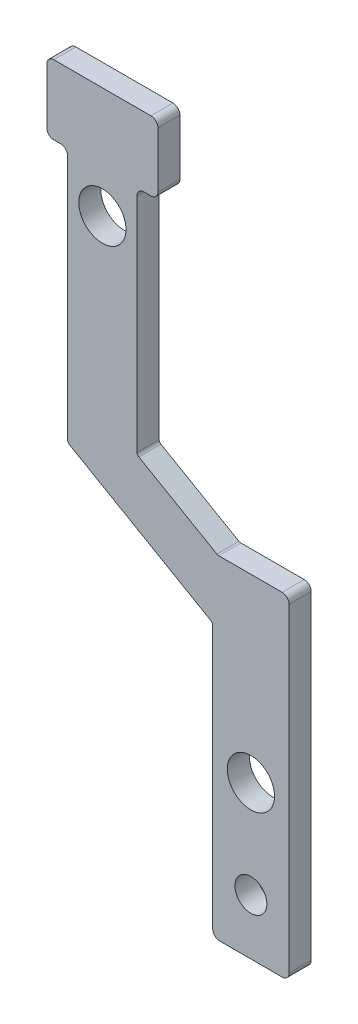
ISO-10303-21;
HEADER;
FILE_DESCRIPTION(('STEP AP214'),'2;1');
FILE_NAME('part.step','',(''),(''),'','','');
FILE_SCHEMA(('AUTOMOTIVE_DESIGN { 1 0 10303 214 1 1 1 1 }'));
ENDSEC;
DATA;
#1=APPLICATION_CONTEXT('core data for automotive mechanical design processes');
#2=APPLICATION_PROTOCOL_DEFINITION('international standard','automotive_design',2000,#1);
#3=PRODUCT_CONTEXT('',#1,'mechanical');
#4=PRODUCT('Part','Part','',(#3));
#5=PRODUCT_RELATED_PRODUCT_CATEGORY('part','',(#4));
#6=PRODUCT_DEFINITION_FORMATION('','',#4);
#7=PRODUCT_DEFINITION_CONTEXT('part definition',#1,'design');
#8=PRODUCT_DEFINITION('design','',#6,#7);
#9=PRODUCT_DEFINITION_SHAPE('','',#8);
#10=(LENGTH_UNIT() NAMED_UNIT(*) SI_UNIT(.MILLI.,.METRE.));
#11=(NAMED_UNIT(*) PLANE_ANGLE_UNIT() SI_UNIT($,.RADIAN.));
#12=(NAMED_UNIT(*) SI_UNIT($,.STERADIAN.) SOLID_ANGLE_UNIT());
#13=UNCERTAINTY_MEASURE_WITH_UNIT(LENGTH_MEASURE(1.E-05),#10,'distance_accuracy_value','');
#14=(GEOMETRIC_REPRESENTATION_CONTEXT(3) GLOBAL_UNCERTAINTY_ASSIGNED_CONTEXT((#13)) GLOBAL_UNIT_ASSIGNED_CONTEXT((#10,
#11,#12)) REPRESENTATION_CONTEXT('',''));
#15=CARTESIAN_POINT('',(0.,0.,0.));
#16=DIRECTION('',(0.,0.,1.));
#17=DIRECTION('',(1.,0.,0.));
#18=AXIS2_PLACEMENT_3D('',#15,#16,#17);
#19=CARTESIAN_POINT('',(8.00627,44.50635,1.59144));
#20=DIRECTION('',(0.,0.,-1.));
#21=DIRECTION('',(-1.,0.,0.));
#22=AXIS2_PLACEMENT_3D('',#19,#20,#21);
#23=PLANE('',#22);
#24=CARTESIAN_POINT('',(15.206,4.006,1.59144));
#25=DIRECTION('',(0.,0.,1.));
#26=DIRECTION('',(1.,0.,0.));
#27=AXIS2_PLACEMENT_3D('',#24,#25,#26);
#28=CIRCLE('',#27,1.15);
#29=CARTESIAN_POINT('',(16.356,4.006,1.59144));
#30=VERTEX_POINT('',#29);
#31=EDGE_CURVE('E469',#30,#30,#28,.T.);
#32=ORIENTED_EDGE('',*,*,#31,.F.);
#33=EDGE_LOOP('',(#32));
#34=FACE_BOUND('',#33,.T.);
#35=CARTESIAN_POINT('',(4.50627,41.00635,1.59144));
#36=DIRECTION('',(0.,0.,1.));
#37=DIRECTION('',(1.,0.,0.));
#38=AXIS2_PLACEMENT_3D('',#35,#36,#37);
#39=CIRCLE('',#38,1.7);
#40=CARTESIAN_POINT('',(6.20627,41.00635,1.59144));
#41=VERTEX_POINT('',#40);
#42=EDGE_CURVE('E471',#41,#41,#39,.T.);
#43=ORIENTED_EDGE('',*,*,#42,.F.);
#44=EDGE_LOOP('',(#43));
#45=FACE_BOUND('',#44,.T.);
#46=CARTESIAN_POINT('',(8.00627,44.50635,1.59144));
#47=DIRECTION('',(0.,0.,1.));
#48=DIRECTION('',(-1.,0.,0.));
#49=AXIS2_PLACEMENT_3D('',#46,#47,#48);
#50=CIRCLE('',#49,0.5);
#51=CARTESIAN_POINT('',(8.00627,44.00635,1.59144));
#52=VERTEX_POINT('',#51);
#53=CARTESIAN_POINT('',(8.50627,44.50635,1.59144));
#54=VERTEX_POINT('',#53);
#55=EDGE_CURVE('E295',#52,#54,#50,.T.);
#56=ORIENTED_EDGE('',*,*,#55,.T.);
#57=DIRECTION('',(0.,1.,0.));
#58=VECTOR('',#57,1.);
#59=CARTESIAN_POINT('',(8.50627,48.50635,1.59144));
#60=LINE('',#59,#58);
#61=CARTESIAN_POINT('',(8.50627,48.50635,1.59144));
#62=VERTEX_POINT('',#61);
#63=EDGE_CURVE('E153',#54,#62,#60,.T.);
#64=ORIENTED_EDGE('',*,*,#63,.T.);
#65=CARTESIAN_POINT('',(8.00627,48.50635,1.59144));
#66=DIRECTION('',(0.,0.,1.));
#67=DIRECTION('',(-1.,0.,0.));
#68=AXIS2_PLACEMENT_3D('',#65,#66,#67);
#69=CIRCLE('',#68,0.500000000000002);
#70=CARTESIAN_POINT('',(8.00627,49.00635,1.59144));
#71=VERTEX_POINT('',#70);
#72=EDGE_CURVE('E364',#62,#71,#69,.T.);
#73=ORIENTED_EDGE('',*,*,#72,.T.);
#74=DIRECTION('',(-1.,0.,0.));
#75=VECTOR('',#74,1.);
#76=CARTESIAN_POINT('',(1.00627,49.00635,1.59144));
#77=LINE('',#76,#75);
#78=CARTESIAN_POINT('',(1.00627,49.00635,1.59144));
#79=VERTEX_POINT('',#78);
#80=EDGE_CURVE('E383',#71,#79,#77,.T.);
#81=ORIENTED_EDGE('',*,*,#80,.T.);
#82=CARTESIAN_POINT('',(1.00627,48.50635,1.59144));
#83=DIRECTION('',(0.,0.,1.));
#84=DIRECTION('',(-1.,0.,0.));
#85=AXIS2_PLACEMENT_3D('',#82,#83,#84);
#86=CIRCLE('',#85,0.499999999999999);
#87=CARTESIAN_POINT('',(0.506269999999998,48.50635,1.59144));
#88=VERTEX_POINT('',#87);
#89=EDGE_CURVE('E380',#79,#88,#86,.T.);
#90=ORIENTED_EDGE('',*,*,#89,.T.);
#91=DIRECTION('',(0.,-1.,0.));
#92=VECTOR('',#91,1.);
#93=CARTESIAN_POINT('',(0.506269999999999,44.50635,1.59144));
#94=LINE('',#93,#92);
#95=CARTESIAN_POINT('',(0.506269999999999,44.50635,1.59144));
#96=VERTEX_POINT('',#95);
#97=EDGE_CURVE('E382',#88,#96,#94,.T.);
#98=ORIENTED_EDGE('',*,*,#97,.T.);
#99=CARTESIAN_POINT('',(1.00627,44.50635,1.59144));
#100=DIRECTION('',(0.,0.,1.));
#101=DIRECTION('',(-1.,0.,0.));
#102=AXIS2_PLACEMENT_3D('',#99,#100,#101);
#103=CIRCLE('',#102,0.500000000000001);
#104=CARTESIAN_POINT('',(1.00627,44.00635,1.59144));
#105=VERTEX_POINT('',#104);
#106=EDGE_CURVE('E385',#96,#105,#103,.T.);
#107=ORIENTED_EDGE('',*,*,#106,.T.);
#108=DIRECTION('',(1.,0.,0.));
#109=VECTOR('',#108,1.);
#110=CARTESIAN_POINT('',(1.50627,44.00635,1.59144));
#111=LINE('',#110,#109);
#112=CARTESIAN_POINT('',(1.50627,44.00635,1.59144));
#113=VERTEX_POINT('',#112);
#114=EDGE_CURVE('E391',#105,#113,#111,.T.);
#115=ORIENTED_EDGE('',*,*,#114,.T.);
#116=CARTESIAN_POINT('',(1.50627,43.50635,1.59144));
#117=DIRECTION('',(0.,0.,-1.));
#118=DIRECTION('',(1.,0.,0.));
#119=AXIS2_PLACEMENT_3D('',#116,#117,#118);
#120=CIRCLE('',#119,0.499999999999999);
#121=CARTESIAN_POINT('',(2.00627,43.50635,1.59144));
#122=VERTEX_POINT('',#121);
#123=EDGE_CURVE('E393',#113,#122,#120,.T.);
#124=ORIENTED_EDGE('',*,*,#123,.T.);
#125=DIRECTION('',(0.,-1.,0.));
#126=VECTOR('',#125,1.);
#127=CARTESIAN_POINT('',(2.00627,25.7742991924311,1.59144));
#128=LINE('',#127,#126);
#129=CARTESIAN_POINT('',(2.00627,25.7742991924311,1.59144));
#130=VERTEX_POINT('',#129);
#131=EDGE_CURVE('E395',#122,#130,#128,.T.);
#132=ORIENTED_EDGE('',*,*,#131,.T.);
#133=CARTESIAN_POINT('',(2.25627000000001,25.7742991924311,1.59144));
#134=DIRECTION('',(0.,0.,1.));
#135=DIRECTION('',(-1.,0.,0.));
#136=AXIS2_PLACEMENT_3D('',#133,#134,#135);
#137=CIRCLE('',#136,0.250000000000003);
#138=CARTESIAN_POINT('',(2.13127000000001,25.557792841485,1.59144));
#139=VERTEX_POINT('',#138);
#140=EDGE_CURVE('E397',#130,#139,#137,.T.);
#141=ORIENTED_EDGE('',*,*,#140,.T.);
#142=DIRECTION('',(0.866025403784439,-0.5,0.));
#143=VECTOR('',#142,1.);
#144=CARTESIAN_POINT('',(12.33127,19.6688200957508,1.59144));
#145=LINE('',#144,#143);
#146=CARTESIAN_POINT('',(12.33127,19.6688200957508,1.59144));
#147=VERTEX_POINT('',#146);
#148=EDGE_CURVE('E399',#139,#147,#145,.T.);
#149=ORIENTED_EDGE('',*,*,#148,.T.);
#150=CARTESIAN_POINT('',(12.20627,19.4523137448047,1.59144));
#151=DIRECTION('',(0.,0.,-1.));
#152=DIRECTION('',(1.,0.,0.));
#153=AXIS2_PLACEMENT_3D('',#150,#151,#152);
#154=CIRCLE('',#153,0.250000000000002);
#155=CARTESIAN_POINT('',(12.45627,19.4523137448047,1.59144));
#156=VERTEX_POINT('',#155);
#157=EDGE_CURVE('E401',#147,#156,#154,.T.);
#158=ORIENTED_EDGE('',*,*,#157,.T.);
#159=DIRECTION('',(0.,-1.,0.));
#160=VECTOR('',#159,1.);
#161=CARTESIAN_POINT('',(12.45627,0.506349999999999,1.59144));
#162=LINE('',#161,#160);
#163=CARTESIAN_POINT('',(12.45627,0.506349999999999,1.59144));
#164=VERTEX_POINT('',#163);
#165=EDGE_CURVE('E403',#156,#164,#162,.T.);
#166=ORIENTED_EDGE('',*,*,#165,.T.);
#167=CARTESIAN_POINT('',(12.95627,0.506349999999999,1.59144));
#168=DIRECTION('',(0.,0.,1.));
#169=DIRECTION('',(-1.,0.,0.));
#170=AXIS2_PLACEMENT_3D('',#167,#168,#169);
#171=CIRCLE('',#170,0.499999999999999);
#172=CARTESIAN_POINT('',(12.95627,0.00634999999999921,1.59144));
#173=VERTEX_POINT('',#172);
#174=EDGE_CURVE('E405',#164,#173,#171,.T.);
#175=ORIENTED_EDGE('',*,*,#174,.T.);
#176=DIRECTION('',(1.,0.,0.));
#177=VECTOR('',#176,1.);
#178=CARTESIAN_POINT('',(17.45627,0.00634999999999893,1.59144));
#179=LINE('',#178,#177);
#180=CARTESIAN_POINT('',(17.45627,0.00634999999999872,1.59144));
#181=VERTEX_POINT('',#180);
#182=EDGE_CURVE('E407',#173,#181,#179,.T.);
#183=ORIENTED_EDGE('',*,*,#182,.T.);
#184=CARTESIAN_POINT('',(17.45627,0.506349999999999,1.59144));
#185=DIRECTION('',(0.,0.,1.));
#186=DIRECTION('',(-1.,0.,0.));
#187=AXIS2_PLACEMENT_3D('',#184,#185,#186);
#188=CIRCLE('',#187,0.5);
#189=CARTESIAN_POINT('',(17.95627,0.506349999999999,1.59144));
#190=VERTEX_POINT('',#189);
#191=EDGE_CURVE('E409',#181,#190,#188,.T.);
#192=ORIENTED_EDGE('',*,*,#191,.T.);
#193=DIRECTION('',(0.,1.,0.));
#194=VECTOR('',#193,1.);
#195=CARTESIAN_POINT('',(17.95627,23.50635,1.59144));
#196=LINE('',#195,#194);
#197=CARTESIAN_POINT('',(17.95627,23.50635,1.59144));
#198=VERTEX_POINT('',#197);
#199=EDGE_CURVE('E411',#190,#198,#196,.T.);
#200=ORIENTED_EDGE('',*,*,#199,.T.);
#201=CARTESIAN_POINT('',(17.45627,23.50635,1.59144));
#202=DIRECTION('',(0.,0.,1.));
#203=DIRECTION('',(-1.,0.,0.));
#204=AXIS2_PLACEMENT_3D('',#201,#202,#203);
#205=CIRCLE('',#204,0.499999999999999);
#206=CARTESIAN_POINT('',(17.45627,24.00635,1.59144));
#207=VERTEX_POINT('',#206);
#208=EDGE_CURVE('E413',#198,#207,#205,.T.);
#209=ORIENTED_EDGE('',*,*,#208,.T.);
#210=DIRECTION('',(-1.,0.,0.));
#211=VECTOR('',#210,1.);
#212=CARTESIAN_POINT('',(12.8854351245988,24.00635,1.59144));
#213=LINE('',#212,#211);
#214=CARTESIAN_POINT('',(12.8854351245988,24.00635,1.59144));
#215=VERTEX_POINT('',#214);
#216=EDGE_CURVE('E415',#207,#215,#213,.T.);
#217=ORIENTED_EDGE('',*,*,#216,.T.);
#218=CARTESIAN_POINT('',(12.8854351245988,24.25635,1.59144));
#219=DIRECTION('',(0.,0.,-1.));
#220=DIRECTION('',(1.,0.,0.));
#221=AXIS2_PLACEMENT_3D('',#218,#219,#220);
#222=CIRCLE('',#221,0.249999999999999);
#223=CARTESIAN_POINT('',(12.7604351245988,24.0398436490539,1.59144));
#224=VERTEX_POINT('',#223);
#225=EDGE_CURVE('E417',#215,#224,#222,.T.);
#226=ORIENTED_EDGE('',*,*,#225,.T.);
#227=DIRECTION('',(-0.866025403784439,0.5,0.));
#228=VECTOR('',#227,1.);
#229=CARTESIAN_POINT('',(7.13126999999998,27.2898436490539,1.59144));
#230=LINE('',#229,#228);
#231=CARTESIAN_POINT('',(7.13126999999999,27.2898436490539,1.59144));
#232=VERTEX_POINT('',#231);
#233=EDGE_CURVE('E419',#224,#232,#230,.T.);
#234=ORIENTED_EDGE('',*,*,#233,.T.);
#235=CARTESIAN_POINT('',(7.25627,27.5063500000001,1.59144));
#236=DIRECTION('',(0.,0.,-1.));
#237=DIRECTION('',(1.,0.,0.));
#238=AXIS2_PLACEMENT_3D('',#235,#236,#237);
#239=CIRCLE('',#238,0.250000000000029);
#240=CARTESIAN_POINT('',(7.00627,27.50635,1.59144));
#241=VERTEX_POINT('',#240);
#242=EDGE_CURVE('E226',#232,#241,#239,.T.);
#243=ORIENTED_EDGE('',*,*,#242,.T.);
#244=DIRECTION('',(0.,1.,0.));
#245=VECTOR('',#244,1.);
#246=CARTESIAN_POINT('',(7.00627,43.50635,1.59144));
#247=LINE('',#246,#245);
#248=CARTESIAN_POINT('',(7.00627,43.50635,1.59144));
#249=VERTEX_POINT('',#248);
#250=EDGE_CURVE('E220',#241,#249,#247,.T.);
#251=ORIENTED_EDGE('',*,*,#250,.T.);
#252=CARTESIAN_POINT('',(7.50627,43.50635,1.59144));
#253=DIRECTION('',(0.,0.,-1.));
#254=DIRECTION('',(1.,0.,0.));
#255=AXIS2_PLACEMENT_3D('',#252,#253,#254);
#256=CIRCLE('',#255,0.5);
#257=CARTESIAN_POINT('',(7.50627,44.00635,1.59144));
#258=VERTEX_POINT('',#257);
#259=EDGE_CURVE('E224',#249,#258,#256,.T.);
#260=ORIENTED_EDGE('',*,*,#259,.T.);
#261=DIRECTION('',(1.,0.,0.));
#262=VECTOR('',#261,1.);
#263=CARTESIAN_POINT('',(8.00627,44.00635,1.59144));
#264=LINE('',#263,#262);
#265=EDGE_CURVE('E56',#258,#52,#264,.T.);
#266=ORIENTED_EDGE('',*,*,#265,.T.);
#267=EDGE_LOOP('',(#56,#64,#73,#81,#90,#98,#107,#115,#124,#132,#141,#149,#158,#166,#175,#183,
#192,#200,#209,#217,#226,#234,#243,#251,#260,#266));
#268=FACE_BOUND('',#267,.T.);
#269=CARTESIAN_POINT('',(15.20627,11.00635,1.59144));
#270=DIRECTION('',(0.,0.,1.));
#271=DIRECTION('',(1.,0.,0.));
#272=AXIS2_PLACEMENT_3D('',#269,#270,#271);
#273=CIRCLE('',#272,1.7);
#274=CARTESIAN_POINT('',(16.90627,11.00635,1.59144));
#275=VERTEX_POINT('',#274);
#276=EDGE_CURVE('E479',#275,#275,#273,.T.);
#277=ORIENTED_EDGE('',*,*,#276,.F.);
#278=EDGE_LOOP('',(#277));
#279=FACE_BOUND('',#278,.T.);
#280=ADVANCED_FACE('F39',(#34,#45,#268,#279),#23,.F.);
#281=CARTESIAN_POINT('',(8.00627,44.50635,0.));
#282=DIRECTION('',(0.,0.,-1.));
#283=DIRECTION('',(-1.,0.,0.));
#284=AXIS2_PLACEMENT_3D('',#281,#282,#283);
#285=PLANE('',#284);
#286=CARTESIAN_POINT('',(15.206,4.006,0.));
#287=DIRECTION('',(0.,0.,1.));
#288=DIRECTION('',(1.,0.,0.));
#289=AXIS2_PLACEMENT_3D('',#286,#287,#288);
#290=CIRCLE('',#289,1.15);
#291=CARTESIAN_POINT('',(16.356,4.006,0.));
#292=VERTEX_POINT('',#291);
#293=EDGE_CURVE('E467',#292,#292,#290,.T.);
#294=ORIENTED_EDGE('',*,*,#293,.T.);
#295=EDGE_LOOP('',(#294));
#296=FACE_BOUND('',#295,.T.);
#297=CARTESIAN_POINT('',(4.50627,41.00635,0.));
#298=DIRECTION('',(0.,0.,1.));
#299=DIRECTION('',(1.,0.,0.));
#300=AXIS2_PLACEMENT_3D('',#297,#298,#299);
#301=CIRCLE('',#300,1.7);
#302=CARTESIAN_POINT('',(6.20627,41.00635,0.));
#303=VERTEX_POINT('',#302);
#304=EDGE_CURVE('E476',#303,#303,#301,.T.);
#305=ORIENTED_EDGE('',*,*,#304,.T.);
#306=EDGE_LOOP('',(#305));
#307=FACE_BOUND('',#306,.T.);
#308=CARTESIAN_POINT('',(8.00627,44.50635,0.));
#309=DIRECTION('',(0.,0.,1.));
#310=DIRECTION('',(-1.,0.,0.));
#311=AXIS2_PLACEMENT_3D('',#308,#309,#310);
#312=CIRCLE('',#311,0.5);
#313=CARTESIAN_POINT('',(8.00627,44.00635,0.));
#314=VERTEX_POINT('',#313);
#315=CARTESIAN_POINT('',(8.50627,44.50635,0.));
#316=VERTEX_POINT('',#315);
#317=EDGE_CURVE('E244',#314,#316,#312,.T.);
#318=ORIENTED_EDGE('',*,*,#317,.F.);
#319=DIRECTION('',(1.,0.,0.));
#320=VECTOR('',#319,1.);
#321=CARTESIAN_POINT('',(8.00627,44.00635,0.));
#322=LINE('',#321,#320);
#323=CARTESIAN_POINT('',(7.50627,44.00635,0.));
#324=VERTEX_POINT('',#323);
#325=EDGE_CURVE('E145',#324,#314,#322,.T.);
#326=ORIENTED_EDGE('',*,*,#325,.F.);
#327=CARTESIAN_POINT('',(7.50627,43.50635,0.));
#328=DIRECTION('',(0.,0.,-1.));
#329=DIRECTION('',(1.,0.,0.));
#330=AXIS2_PLACEMENT_3D('',#327,#328,#329);
#331=CIRCLE('',#330,0.5);
#332=CARTESIAN_POINT('',(7.00627,43.50635,0.));
#333=VERTEX_POINT('',#332);
#334=EDGE_CURVE('E139',#333,#324,#331,.T.);
#335=ORIENTED_EDGE('',*,*,#334,.F.);
#336=DIRECTION('',(0.,1.,0.));
#337=VECTOR('',#336,1.);
#338=CARTESIAN_POINT('',(7.00627,43.50635,0.));
#339=LINE('',#338,#337);
#340=CARTESIAN_POINT('',(7.00627,27.50635,0.));
#341=VERTEX_POINT('',#340);
#342=EDGE_CURVE('E234',#341,#333,#339,.T.);
#343=ORIENTED_EDGE('',*,*,#342,.F.);
#344=CARTESIAN_POINT('',(7.25627,27.5063500000001,0.));
#345=DIRECTION('',(0.,0.,-1.));
#346=DIRECTION('',(1.,0.,0.));
#347=AXIS2_PLACEMENT_3D('',#344,#345,#346);
#348=CIRCLE('',#347,0.250000000000029);
#349=CARTESIAN_POINT('',(7.13126999999999,27.2898436490539,0.));
#350=VERTEX_POINT('',#349);
#351=EDGE_CURVE('E290',#350,#341,#348,.T.);
#352=ORIENTED_EDGE('',*,*,#351,.F.);
#353=DIRECTION('',(-0.866025403784439,0.5,0.));
#354=VECTOR('',#353,1.);
#355=CARTESIAN_POINT('',(7.13126999999998,27.2898436490539,0.));
#356=LINE('',#355,#354);
#357=CARTESIAN_POINT('',(12.7604351245988,24.0398436490539,0.));
#358=VERTEX_POINT('',#357);
#359=EDGE_CURVE('E288',#358,#350,#356,.T.);
#360=ORIENTED_EDGE('',*,*,#359,.F.);
#361=CARTESIAN_POINT('',(12.8854351245988,24.25635,0.));
#362=DIRECTION('',(0.,0.,-1.));
#363=DIRECTION('',(1.,0.,0.));
#364=AXIS2_PLACEMENT_3D('',#361,#362,#363);
#365=CIRCLE('',#364,0.249999999999999);
#366=CARTESIAN_POINT('',(12.8854351245988,24.00635,0.));
#367=VERTEX_POINT('',#366);
#368=EDGE_CURVE('E286',#367,#358,#365,.T.);
#369=ORIENTED_EDGE('',*,*,#368,.F.);
#370=DIRECTION('',(-1.,0.,0.));
#371=VECTOR('',#370,1.);
#372=CARTESIAN_POINT('',(12.8854351245988,24.00635,0.));
#373=LINE('',#372,#371);
#374=CARTESIAN_POINT('',(17.45627,24.00635,0.));
#375=VERTEX_POINT('',#374);
#376=EDGE_CURVE('E284',#375,#367,#373,.T.);
#377=ORIENTED_EDGE('',*,*,#376,.F.);
#378=CARTESIAN_POINT('',(17.45627,23.50635,0.));
#379=DIRECTION('',(0.,0.,1.));
#380=DIRECTION('',(-1.,0.,0.));
#381=AXIS2_PLACEMENT_3D('',#378,#379,#380);
#382=CIRCLE('',#381,0.499999999999999);
#383=CARTESIAN_POINT('',(17.95627,23.50635,0.));
#384=VERTEX_POINT('',#383);
#385=EDGE_CURVE('E282',#384,#375,#382,.T.);
#386=ORIENTED_EDGE('',*,*,#385,.F.);
#387=DIRECTION('',(0.,1.,0.));
#388=VECTOR('',#387,1.);
#389=CARTESIAN_POINT('',(17.95627,23.50635,0.));
#390=LINE('',#389,#388);
#391=CARTESIAN_POINT('',(17.95627,0.506349999999999,0.));
#392=VERTEX_POINT('',#391);
#393=EDGE_CURVE('E280',#392,#384,#390,.T.);
#394=ORIENTED_EDGE('',*,*,#393,.F.);
#395=CARTESIAN_POINT('',(17.45627,0.506349999999999,0.));
#396=DIRECTION('',(0.,0.,1.));
#397=DIRECTION('',(-1.,0.,0.));
#398=AXIS2_PLACEMENT_3D('',#395,#396,#397);
#399=CIRCLE('',#398,0.5);
#400=CARTESIAN_POINT('',(17.45627,0.00634999999999872,0.));
#401=VERTEX_POINT('',#400);
#402=EDGE_CURVE('E278',#401,#392,#399,.T.);
#403=ORIENTED_EDGE('',*,*,#402,.F.);
#404=DIRECTION('',(1.,0.,0.));
#405=VECTOR('',#404,1.);
#406=CARTESIAN_POINT('',(17.45627,0.00634999999999893,0.));
#407=LINE('',#406,#405);
#408=CARTESIAN_POINT('',(12.95627,0.00634999999999921,0.));
#409=VERTEX_POINT('',#408);
#410=EDGE_CURVE('E276',#409,#401,#407,.T.);
#411=ORIENTED_EDGE('',*,*,#410,.F.);
#412=CARTESIAN_POINT('',(12.95627,0.506349999999999,0.));
#413=DIRECTION('',(0.,0.,1.));
#414=DIRECTION('',(-1.,0.,0.));
#415=AXIS2_PLACEMENT_3D('',#412,#413,#414);
#416=CIRCLE('',#415,0.499999999999999);
#417=CARTESIAN_POINT('',(12.45627,0.506349999999999,0.));
#418=VERTEX_POINT('',#417);
#419=EDGE_CURVE('E274',#418,#409,#416,.T.);
#420=ORIENTED_EDGE('',*,*,#419,.F.);
#421=DIRECTION('',(0.,-1.,0.));
#422=VECTOR('',#421,1.);
#423=CARTESIAN_POINT('',(12.45627,0.506349999999999,0.));
#424=LINE('',#423,#422);
#425=CARTESIAN_POINT('',(12.45627,19.4523137448047,0.));
#426=VERTEX_POINT('',#425);
#427=EDGE_CURVE('E272',#426,#418,#424,.T.);
#428=ORIENTED_EDGE('',*,*,#427,.F.);
#429=CARTESIAN_POINT('',(12.20627,19.4523137448047,0.));
#430=DIRECTION('',(0.,0.,-1.));
#431=DIRECTION('',(1.,0.,0.));
#432=AXIS2_PLACEMENT_3D('',#429,#430,#431);
#433=CIRCLE('',#432,0.250000000000002);
#434=CARTESIAN_POINT('',(12.33127,19.6688200957508,0.));
#435=VERTEX_POINT('',#434);
#436=EDGE_CURVE('E270',#435,#426,#433,.T.);
#437=ORIENTED_EDGE('',*,*,#436,.F.);
#438=DIRECTION('',(0.866025403784439,-0.5,0.));
#439=VECTOR('',#438,1.);
#440=CARTESIAN_POINT('',(12.33127,19.6688200957508,0.));
#441=LINE('',#440,#439);
#442=CARTESIAN_POINT('',(2.13127000000001,25.557792841485,0.));
#443=VERTEX_POINT('',#442);
#444=EDGE_CURVE('E268',#443,#435,#441,.T.);
#445=ORIENTED_EDGE('',*,*,#444,.F.);
#446=CARTESIAN_POINT('',(2.25627000000001,25.7742991924311,0.));
#447=DIRECTION('',(0.,0.,1.));
#448=DIRECTION('',(-1.,0.,0.));
#449=AXIS2_PLACEMENT_3D('',#446,#447,#448);
#450=CIRCLE('',#449,0.250000000000003);
#451=CARTESIAN_POINT('',(2.00627,25.7742991924311,0.));
#452=VERTEX_POINT('',#451);
#453=EDGE_CURVE('E266',#452,#443,#450,.T.);
#454=ORIENTED_EDGE('',*,*,#453,.F.);
#455=DIRECTION('',(0.,-1.,0.));
#456=VECTOR('',#455,1.);
#457=CARTESIAN_POINT('',(2.00627,25.7742991924311,0.));
#458=LINE('',#457,#456);
#459=CARTESIAN_POINT('',(2.00627,43.50635,0.));
#460=VERTEX_POINT('',#459);
#461=EDGE_CURVE('E264',#460,#452,#458,.T.);
#462=ORIENTED_EDGE('',*,*,#461,.F.);
#463=CARTESIAN_POINT('',(1.50627,43.50635,0.));
#464=DIRECTION('',(0.,0.,-1.));
#465=DIRECTION('',(1.,0.,0.));
#466=AXIS2_PLACEMENT_3D('',#463,#464,#465);
#467=CIRCLE('',#466,0.499999999999999);
#468=CARTESIAN_POINT('',(1.50627,44.00635,0.));
#469=VERTEX_POINT('',#468);
#470=EDGE_CURVE('E262',#469,#460,#467,.T.);
#471=ORIENTED_EDGE('',*,*,#470,.F.);
#472=DIRECTION('',(1.,0.,0.));
#473=VECTOR('',#472,1.);
#474=CARTESIAN_POINT('',(1.50627,44.00635,0.));
#475=LINE('',#474,#473);
#476=CARTESIAN_POINT('',(1.00627,44.00635,0.));
#477=VERTEX_POINT('',#476);
#478=EDGE_CURVE('E260',#477,#469,#475,.T.);
#479=ORIENTED_EDGE('',*,*,#478,.F.);
#480=CARTESIAN_POINT('',(1.00627,44.50635,0.));
#481=DIRECTION('',(0.,0.,1.));
#482=DIRECTION('',(-1.,0.,0.));
#483=AXIS2_PLACEMENT_3D('',#480,#481,#482);
#484=CIRCLE('',#483,0.500000000000001);
#485=CARTESIAN_POINT('',(0.506269999999999,44.50635,0.));
#486=VERTEX_POINT('',#485);
#487=EDGE_CURVE('E258',#486,#477,#484,.T.);
#488=ORIENTED_EDGE('',*,*,#487,.F.);
#489=DIRECTION('',(0.,-1.,0.));
#490=VECTOR('',#489,1.);
#491=CARTESIAN_POINT('',(0.506269999999999,44.50635,0.));
#492=LINE('',#491,#490);
#493=CARTESIAN_POINT('',(0.506269999999998,48.50635,0.));
#494=VERTEX_POINT('',#493);
#495=EDGE_CURVE('E256',#494,#486,#492,.T.);
#496=ORIENTED_EDGE('',*,*,#495,.F.);
#497=CARTESIAN_POINT('',(1.00627,48.50635,0.));
#498=DIRECTION('',(0.,0.,1.));
#499=DIRECTION('',(-1.,0.,0.));
#500=AXIS2_PLACEMENT_3D('',#497,#498,#499);
#501=CIRCLE('',#500,0.499999999999999);
#502=CARTESIAN_POINT('',(1.00627,49.00635,0.));
#503=VERTEX_POINT('',#502);
#504=EDGE_CURVE('E254',#503,#494,#501,.T.);
#505=ORIENTED_EDGE('',*,*,#504,.F.);
#506=DIRECTION('',(-1.,0.,0.));
#507=VECTOR('',#506,1.);
#508=CARTESIAN_POINT('',(1.00627,49.00635,0.));
#509=LINE('',#508,#507);
#510=CARTESIAN_POINT('',(8.00627,49.00635,0.));
#511=VERTEX_POINT('',#510);
#512=EDGE_CURVE('E252',#511,#503,#509,.T.);
#513=ORIENTED_EDGE('',*,*,#512,.F.);
#514=CARTESIAN_POINT('',(8.00627,48.50635,0.));
#515=DIRECTION('',(0.,0.,1.));
#516=DIRECTION('',(-1.,0.,0.));
#517=AXIS2_PLACEMENT_3D('',#514,#515,#516);
#518=CIRCLE('',#517,0.500000000000002);
#519=CARTESIAN_POINT('',(8.50627,48.50635,0.));
#520=VERTEX_POINT('',#519);
#521=EDGE_CURVE('E250',#520,#511,#518,.T.);
#522=ORIENTED_EDGE('',*,*,#521,.F.);
#523=DIRECTION('',(0.,1.,0.));
#524=VECTOR('',#523,1.);
#525=CARTESIAN_POINT('',(8.50627,48.50635,0.));
#526=LINE('',#525,#524);
#527=EDGE_CURVE('E247',#316,#520,#526,.T.);
#528=ORIENTED_EDGE('',*,*,#527,.F.);
#529=EDGE_LOOP('',(#318,#326,#335,#343,#352,#360,#369,#377,#386,#394,#403,#411,#420,#428,#437,
#445,#454,#462,#471,#479,#488,#496,#505,#513,#522,#528));
#530=FACE_BOUND('',#529,.T.);
#531=CARTESIAN_POINT('',(15.20627,11.00635,0.));
#532=DIRECTION('',(0.,0.,1.));
#533=DIRECTION('',(1.,0.,0.));
#534=AXIS2_PLACEMENT_3D('',#531,#532,#533);
#535=CIRCLE('',#534,1.7);
#536=CARTESIAN_POINT('',(16.90627,11.00635,0.));
#537=VERTEX_POINT('',#536);
#538=EDGE_CURVE('E248',#537,#537,#535,.T.);
#539=ORIENTED_EDGE('',*,*,#538,.T.);
#540=EDGE_LOOP('',(#539));
#541=FACE_BOUND('',#540,.T.);
#542=ADVANCED_FACE('F368',(#296,#307,#530,#541),#285,.T.);
#543=CARTESIAN_POINT('',(8.00627,44.50635,1.59144));
#544=DIRECTION('',(0.,0.,-1.));
#545=DIRECTION('',(-1.,0.,0.));
#546=AXIS2_PLACEMENT_3D('',#543,#544,#545);
#547=CYLINDRICAL_SURFACE('',#546,0.5);
#548=ORIENTED_EDGE('',*,*,#317,.T.);
#549=DIRECTION('',(0.,0.,-1.));
#550=VECTOR('',#549,1.);
#551=CARTESIAN_POINT('',(8.50627,44.50635,1.59144));
#552=LINE('',#551,#550);
#553=EDGE_CURVE('E11',#54,#316,#552,.T.);
#554=ORIENTED_EDGE('',*,*,#553,.F.);
#555=ORIENTED_EDGE('',*,*,#55,.F.);
#556=DIRECTION('',(0.,0.,-1.));
#557=VECTOR('',#556,1.);
#558=CARTESIAN_POINT('',(8.00627,44.00635,1.59144));
#559=LINE('',#558,#557);
#560=EDGE_CURVE('E240',#52,#314,#559,.T.);
#561=ORIENTED_EDGE('',*,*,#560,.T.);
#562=EDGE_LOOP('',(#548,#554,#555,#561));
#563=FACE_BOUND('',#562,.T.);
#564=ADVANCED_FACE('F41',(#563),#547,.T.);
#565=CARTESIAN_POINT('',(8.50627,48.50635,1.59144));
#566=DIRECTION('',(-1.,0.,0.));
#567=DIRECTION('',(0.,0.,1.));
#568=AXIS2_PLACEMENT_3D('',#565,#566,#567);
#569=PLANE('',#568);
#570=ORIENTED_EDGE('',*,*,#527,.T.);
#571=DIRECTION('',(0.,0.,-1.));
#572=VECTOR('',#571,1.);
#573=CARTESIAN_POINT('',(8.50627,48.50635,1.59144));
#574=LINE('',#573,#572);
#575=EDGE_CURVE('E48',#62,#520,#574,.T.);
#576=ORIENTED_EDGE('',*,*,#575,.F.);
#577=ORIENTED_EDGE('',*,*,#63,.F.);
#578=ORIENTED_EDGE('',*,*,#553,.T.);
#579=EDGE_LOOP('',(#570,#576,#577,#578));
#580=FACE_BOUND('',#579,.T.);
#581=ADVANCED_FACE('F746',(#580),#569,.F.);
#582=CARTESIAN_POINT('',(8.00627,48.50635,1.59144));
#583=DIRECTION('',(0.,0.,-1.));
#584=DIRECTION('',(-1.,0.,0.));
#585=AXIS2_PLACEMENT_3D('',#582,#583,#584);
#586=CYLINDRICAL_SURFACE('',#585,0.500000000000002);
#587=ORIENTED_EDGE('',*,*,#521,.T.);
#588=DIRECTION('',(0.,0.,-1.));
#589=VECTOR('',#588,1.);
#590=CARTESIAN_POINT('',(8.00627,49.00635,1.59144));
#591=LINE('',#590,#589);
#592=EDGE_CURVE('E356',#71,#511,#591,.T.);
#593=ORIENTED_EDGE('',*,*,#592,.F.);
#594=ORIENTED_EDGE('',*,*,#72,.F.);
#595=ORIENTED_EDGE('',*,*,#575,.T.);
#596=EDGE_LOOP('',(#587,#593,#594,#595));
#597=FACE_BOUND('',#596,.T.);
#598=ADVANCED_FACE('F362',(#597),#586,.T.);
#599=CARTESIAN_POINT('',(1.00627,49.00635,1.59144));
#600=DIRECTION('',(0.,-1.,0.));
#601=DIRECTION('',(0.,0.,-1.));
#602=AXIS2_PLACEMENT_3D('',#599,#600,#601);
#603=PLANE('',#602);
#604=ORIENTED_EDGE('',*,*,#512,.T.);
#605=DIRECTION('',(0.,0.,-1.));
#606=VECTOR('',#605,1.);
#607=CARTESIAN_POINT('',(1.00627,49.00635,1.59144));
#608=LINE('',#607,#606);
#609=EDGE_CURVE('E353',#79,#503,#608,.T.);
#610=ORIENTED_EDGE('',*,*,#609,.F.);
#611=ORIENTED_EDGE('',*,*,#80,.F.);
#612=ORIENTED_EDGE('',*,*,#592,.T.);
#613=EDGE_LOOP('',(#604,#610,#611,#612));
#614=FACE_BOUND('',#613,.T.);
#615=ADVANCED_FACE('F374',(#614),#603,.F.);
#616=CARTESIAN_POINT('',(1.00627,48.50635,1.59144));
#617=DIRECTION('',(0.,0.,-1.));
#618=DIRECTION('',(-1.,0.,0.));
#619=AXIS2_PLACEMENT_3D('',#616,#617,#618);
#620=CYLINDRICAL_SURFACE('',#619,0.499999999999999);
#621=ORIENTED_EDGE('',*,*,#504,.T.);
#622=DIRECTION('',(0.,0.,-1.));
#623=VECTOR('',#622,1.);
#624=CARTESIAN_POINT('',(0.506269999999998,48.50635,1.59144));
#625=LINE('',#624,#623);
#626=EDGE_CURVE('E350',#88,#494,#625,.T.);
#627=ORIENTED_EDGE('',*,*,#626,.F.);
#628=ORIENTED_EDGE('',*,*,#89,.F.);
#629=ORIENTED_EDGE('',*,*,#609,.T.);
#630=EDGE_LOOP('',(#621,#627,#628,#629));
#631=FACE_BOUND('',#630,.T.);
#632=ADVANCED_FACE('F378',(#631),#620,.T.);
#633=CARTESIAN_POINT('',(0.506269999999999,44.50635,1.59144));
#634=DIRECTION('',(1.,0.,0.));
#635=DIRECTION('',(0.,1.,0.));
#636=AXIS2_PLACEMENT_3D('',#633,#634,#635);
#637=PLANE('',#636);
#638=ORIENTED_EDGE('',*,*,#495,.T.);
#639=DIRECTION('',(0.,0.,-1.));
#640=VECTOR('',#639,1.);
#641=CARTESIAN_POINT('',(0.506269999999999,44.50635,1.59144));
#642=LINE('',#641,#640);
#643=EDGE_CURVE('E347',#96,#486,#642,.T.);
#644=ORIENTED_EDGE('',*,*,#643,.F.);
#645=ORIENTED_EDGE('',*,*,#97,.F.);
#646=ORIENTED_EDGE('',*,*,#626,.T.);
#647=EDGE_LOOP('',(#638,#644,#645,#646));
#648=FACE_BOUND('',#647,.T.);
#649=ADVANCED_FACE('F707',(#648),#637,.F.);
#650=CARTESIAN_POINT('',(1.00627,44.50635,1.59144));
#651=DIRECTION('',(0.,0.,-1.));
#652=DIRECTION('',(-1.,0.,0.));
#653=AXIS2_PLACEMENT_3D('',#650,#651,#652);
#654=CYLINDRICAL_SURFACE('',#653,0.500000000000001);
#655=ORIENTED_EDGE('',*,*,#487,.T.);
#656=DIRECTION('',(0.,0.,-1.));
#657=VECTOR('',#656,1.);
#658=CARTESIAN_POINT('',(1.00627,44.00635,1.59144));
#659=LINE('',#658,#657);
#660=EDGE_CURVE('E344',#105,#477,#659,.T.);
#661=ORIENTED_EDGE('',*,*,#660,.F.);
#662=ORIENTED_EDGE('',*,*,#106,.F.);
#663=ORIENTED_EDGE('',*,*,#643,.T.);
#664=EDGE_LOOP('',(#655,#661,#662,#663));
#665=FACE_BOUND('',#664,.T.);
#666=ADVANCED_FACE('F696',(#665),#654,.T.);
#667=CARTESIAN_POINT('',(1.50627,44.00635,1.59144));
#668=DIRECTION('',(0.,1.,0.));
#669=DIRECTION('',(0.,0.,1.));
#670=AXIS2_PLACEMENT_3D('',#667,#668,#669);
#671=PLANE('',#670);
#672=ORIENTED_EDGE('',*,*,#478,.T.);
#673=DIRECTION('',(0.,0.,-1.));
#674=VECTOR('',#673,1.);
#675=CARTESIAN_POINT('',(1.50627,44.00635,1.59144));
#676=LINE('',#675,#674);
#677=EDGE_CURVE('E341',#113,#469,#676,.T.);
#678=ORIENTED_EDGE('',*,*,#677,.F.);
#679=ORIENTED_EDGE('',*,*,#114,.F.);
#680=ORIENTED_EDGE('',*,*,#660,.T.);
#681=EDGE_LOOP('',(#672,#678,#679,#680));
#682=FACE_BOUND('',#681,.T.);
#683=ADVANCED_FACE('F685',(#682),#671,.F.);
#684=CARTESIAN_POINT('',(1.50627,43.50635,1.59144));
#685=DIRECTION('',(0.,0.,-1.));
#686=DIRECTION('',(-1.,0.,0.));
#687=AXIS2_PLACEMENT_3D('',#684,#685,#686);
#688=CYLINDRICAL_SURFACE('',#687,0.499999999999999);
#689=ORIENTED_EDGE('',*,*,#470,.T.);
#690=DIRECTION('',(0.,0.,-1.));
#691=VECTOR('',#690,1.);
#692=CARTESIAN_POINT('',(2.00627,43.50635,1.59144));
#693=LINE('',#692,#691);
#694=EDGE_CURVE('E338',#122,#460,#693,.T.);
#695=ORIENTED_EDGE('',*,*,#694,.F.);
#696=ORIENTED_EDGE('',*,*,#123,.F.);
#697=ORIENTED_EDGE('',*,*,#677,.T.);
#698=EDGE_LOOP('',(#689,#695,#696,#697));
#699=FACE_BOUND('',#698,.T.);
#700=ADVANCED_FACE('F674',(#699),#688,.F.);
#701=CARTESIAN_POINT('',(2.00627,25.7742991924311,1.59144));
#702=DIRECTION('',(1.,0.,0.));
#703=DIRECTION('',(0.,1.,0.));
#704=AXIS2_PLACEMENT_3D('',#701,#702,#703);
#705=PLANE('',#704);
#706=ORIENTED_EDGE('',*,*,#461,.T.);
#707=DIRECTION('',(0.,0.,-1.));
#708=VECTOR('',#707,1.);
#709=CARTESIAN_POINT('',(2.00627,25.7742991924311,1.59144));
#710=LINE('',#709,#708);
#711=EDGE_CURVE('E335',#130,#452,#710,.T.);
#712=ORIENTED_EDGE('',*,*,#711,.F.);
#713=ORIENTED_EDGE('',*,*,#131,.F.);
#714=ORIENTED_EDGE('',*,*,#694,.T.);
#715=EDGE_LOOP('',(#706,#712,#713,#714));
#716=FACE_BOUND('',#715,.T.);
#717=ADVANCED_FACE('F663',(#716),#705,.F.);
#718=CARTESIAN_POINT('',(2.25627000000001,25.7742991924311,1.59144));
#719=DIRECTION('',(0.,0.,-1.));
#720=DIRECTION('',(-1.,0.,0.));
#721=AXIS2_PLACEMENT_3D('',#718,#719,#720);
#722=CYLINDRICAL_SURFACE('',#721,0.250000000000003);
#723=ORIENTED_EDGE('',*,*,#453,.T.);
#724=DIRECTION('',(0.,0.,-1.));
#725=VECTOR('',#724,1.);
#726=CARTESIAN_POINT('',(2.13127000000001,25.557792841485,1.59144));
#727=LINE('',#726,#725);
#728=EDGE_CURVE('E332',#139,#443,#727,.T.);
#729=ORIENTED_EDGE('',*,*,#728,.F.);
#730=ORIENTED_EDGE('',*,*,#140,.F.);
#731=ORIENTED_EDGE('',*,*,#711,.T.);
#732=EDGE_LOOP('',(#723,#729,#730,#731));
#733=FACE_BOUND('',#732,.T.);
#734=ADVANCED_FACE('F652',(#733),#722,.T.);
#735=CARTESIAN_POINT('',(12.33127,19.6688200957508,1.59144));
#736=DIRECTION('',(0.5,0.866025403784439,0.));
#737=DIRECTION('',(-0.866025403784439,0.5,0.));
#738=AXIS2_PLACEMENT_3D('',#735,#736,#737);
#739=PLANE('',#738);
#740=ORIENTED_EDGE('',*,*,#444,.T.);
#741=DIRECTION('',(0.,0.,-1.));
#742=VECTOR('',#741,1.);
#743=CARTESIAN_POINT('',(12.33127,19.6688200957508,1.59144));
#744=LINE('',#743,#742);
#745=EDGE_CURVE('E329',#147,#435,#744,.T.);
#746=ORIENTED_EDGE('',*,*,#745,.F.);
#747=ORIENTED_EDGE('',*,*,#148,.F.);
#748=ORIENTED_EDGE('',*,*,#728,.T.);
#749=EDGE_LOOP('',(#740,#746,#747,#748));
#750=FACE_BOUND('',#749,.T.);
#751=ADVANCED_FACE('F641',(#750),#739,.F.);
#752=CARTESIAN_POINT('',(12.20627,19.4523137448047,1.59144));
#753=DIRECTION('',(0.,0.,-1.));
#754=DIRECTION('',(-1.,0.,0.));
#755=AXIS2_PLACEMENT_3D('',#752,#753,#754);
#756=CYLINDRICAL_SURFACE('',#755,0.250000000000002);
#757=ORIENTED_EDGE('',*,*,#436,.T.);
#758=DIRECTION('',(0.,0.,-1.));
#759=VECTOR('',#758,1.);
#760=CARTESIAN_POINT('',(12.45627,19.4523137448047,1.59144));
#761=LINE('',#760,#759);
#762=EDGE_CURVE('E326',#156,#426,#761,.T.);
#763=ORIENTED_EDGE('',*,*,#762,.F.);
#764=ORIENTED_EDGE('',*,*,#157,.F.);
#765=ORIENTED_EDGE('',*,*,#745,.T.);
#766=EDGE_LOOP('',(#757,#763,#764,#765));
#767=FACE_BOUND('',#766,.T.);
#768=ADVANCED_FACE('F630',(#767),#756,.F.);
#769=CARTESIAN_POINT('',(12.45627,0.506349999999999,1.59144));
#770=DIRECTION('',(1.,0.,0.));
#771=DIRECTION('',(0.,1.,0.));
#772=AXIS2_PLACEMENT_3D('',#769,#770,#771);
#773=PLANE('',#772);
#774=ORIENTED_EDGE('',*,*,#427,.T.);
#775=DIRECTION('',(0.,0.,-1.));
#776=VECTOR('',#775,1.);
#777=CARTESIAN_POINT('',(12.45627,0.506349999999999,1.59144));
#778=LINE('',#777,#776);
#779=EDGE_CURVE('E323',#164,#418,#778,.T.);
#780=ORIENTED_EDGE('',*,*,#779,.F.);
#781=ORIENTED_EDGE('',*,*,#165,.F.);
#782=ORIENTED_EDGE('',*,*,#762,.T.);
#783=EDGE_LOOP('',(#774,#780,#781,#782));
#784=FACE_BOUND('',#783,.T.);
#785=ADVANCED_FACE('F619',(#784),#773,.F.);
#786=CARTESIAN_POINT('',(12.95627,0.506349999999999,1.59144));
#787=DIRECTION('',(0.,0.,-1.));
#788=DIRECTION('',(-1.,0.,0.));
#789=AXIS2_PLACEMENT_3D('',#786,#787,#788);
#790=CYLINDRICAL_SURFACE('',#789,0.499999999999999);
#791=ORIENTED_EDGE('',*,*,#419,.T.);
#792=DIRECTION('',(0.,0.,-1.));
#793=VECTOR('',#792,1.);
#794=CARTESIAN_POINT('',(12.95627,0.00634999999999921,1.59144));
#795=LINE('',#794,#793);
#796=EDGE_CURVE('E320',#173,#409,#795,.T.);
#797=ORIENTED_EDGE('',*,*,#796,.F.);
#798=ORIENTED_EDGE('',*,*,#174,.F.);
#799=ORIENTED_EDGE('',*,*,#779,.T.);
#800=EDGE_LOOP('',(#791,#797,#798,#799));
#801=FACE_BOUND('',#800,.T.);
#802=ADVANCED_FACE('F608',(#801),#790,.T.);
#803=CARTESIAN_POINT('',(17.45627,0.00634999999999893,1.59144));
#804=DIRECTION('',(0.,1.,0.));
#805=DIRECTION('',(-1.,0.,0.));
#806=AXIS2_PLACEMENT_3D('',#803,#804,#805);
#807=PLANE('',#806);
#808=ORIENTED_EDGE('',*,*,#410,.T.);
#809=DIRECTION('',(0.,0.,-1.));
#810=VECTOR('',#809,1.);
#811=CARTESIAN_POINT('',(17.45627,0.00634999999999872,1.59144));
#812=LINE('',#811,#810);
#813=EDGE_CURVE('E317',#181,#401,#812,.T.);
#814=ORIENTED_EDGE('',*,*,#813,.F.);
#815=ORIENTED_EDGE('',*,*,#182,.F.);
#816=ORIENTED_EDGE('',*,*,#796,.T.);
#817=EDGE_LOOP('',(#808,#814,#815,#816));
#818=FACE_BOUND('',#817,.T.);
#819=ADVANCED_FACE('F597',(#818),#807,.F.);
#820=CARTESIAN_POINT('',(17.45627,0.506349999999999,1.59144));
#821=DIRECTION('',(0.,0.,-1.));
#822=DIRECTION('',(-1.,0.,0.));
#823=AXIS2_PLACEMENT_3D('',#820,#821,#822);
#824=CYLINDRICAL_SURFACE('',#823,0.5);
#825=ORIENTED_EDGE('',*,*,#402,.T.);
#826=DIRECTION('',(0.,0.,-1.));
#827=VECTOR('',#826,1.);
#828=CARTESIAN_POINT('',(17.95627,0.506349999999999,1.59144));
#829=LINE('',#828,#827);
#830=EDGE_CURVE('E314',#190,#392,#829,.T.);
#831=ORIENTED_EDGE('',*,*,#830,.F.);
#832=ORIENTED_EDGE('',*,*,#191,.F.);
#833=ORIENTED_EDGE('',*,*,#813,.T.);
#834=EDGE_LOOP('',(#825,#831,#832,#833));
#835=FACE_BOUND('',#834,.T.);
#836=ADVANCED_FACE('F586',(#835),#824,.T.);
#837=CARTESIAN_POINT('',(17.95627,23.50635,1.59144));
#838=DIRECTION('',(-1.,0.,0.));
#839=DIRECTION('',(0.,-1.,0.));
#840=AXIS2_PLACEMENT_3D('',#837,#838,#839);
#841=PLANE('',#840);
#842=ORIENTED_EDGE('',*,*,#393,.T.);
#843=DIRECTION('',(0.,0.,-1.));
#844=VECTOR('',#843,1.);
#845=CARTESIAN_POINT('',(17.95627,23.50635,1.59144));
#846=LINE('',#845,#844);
#847=EDGE_CURVE('E311',#198,#384,#846,.T.);
#848=ORIENTED_EDGE('',*,*,#847,.F.);
#849=ORIENTED_EDGE('',*,*,#199,.F.);
#850=ORIENTED_EDGE('',*,*,#830,.T.);
#851=EDGE_LOOP('',(#842,#848,#849,#850));
#852=FACE_BOUND('',#851,.T.);
#853=ADVANCED_FACE('F575',(#852),#841,.F.);
#854=CARTESIAN_POINT('',(17.45627,23.50635,1.59144));
#855=DIRECTION('',(0.,0.,-1.));
#856=DIRECTION('',(-1.,0.,0.));
#857=AXIS2_PLACEMENT_3D('',#854,#855,#856);
#858=CYLINDRICAL_SURFACE('',#857,0.499999999999999);
#859=ORIENTED_EDGE('',*,*,#385,.T.);
#860=DIRECTION('',(0.,0.,-1.));
#861=VECTOR('',#860,1.);
#862=CARTESIAN_POINT('',(17.45627,24.00635,1.59144));
#863=LINE('',#862,#861);
#864=EDGE_CURVE('E308',#207,#375,#863,.T.);
#865=ORIENTED_EDGE('',*,*,#864,.F.);
#866=ORIENTED_EDGE('',*,*,#208,.F.);
#867=ORIENTED_EDGE('',*,*,#847,.T.);
#868=EDGE_LOOP('',(#859,#865,#866,#867));
#869=FACE_BOUND('',#868,.T.);
#870=ADVANCED_FACE('F564',(#869),#858,.T.);
#871=CARTESIAN_POINT('',(12.8854351245988,24.00635,1.59144));
#872=DIRECTION('',(0.,-1.,0.));
#873=DIRECTION('',(1.,0.,0.));
#874=AXIS2_PLACEMENT_3D('',#871,#872,#873);
#875=PLANE('',#874);
#876=ORIENTED_EDGE('',*,*,#376,.T.);
#877=DIRECTION('',(0.,0.,-1.));
#878=VECTOR('',#877,1.);
#879=CARTESIAN_POINT('',(12.8854351245988,24.00635,1.59144));
#880=LINE('',#879,#878);
#881=EDGE_CURVE('E305',#215,#367,#880,.T.);
#882=ORIENTED_EDGE('',*,*,#881,.F.);
#883=ORIENTED_EDGE('',*,*,#216,.F.);
#884=ORIENTED_EDGE('',*,*,#864,.T.);
#885=EDGE_LOOP('',(#876,#882,#883,#884));
#886=FACE_BOUND('',#885,.T.);
#887=ADVANCED_FACE('F553',(#886),#875,.F.);
#888=CARTESIAN_POINT('',(12.8854351245988,24.25635,1.59144));
#889=DIRECTION('',(0.,0.,-1.));
#890=DIRECTION('',(-1.,0.,0.));
#891=AXIS2_PLACEMENT_3D('',#888,#889,#890);
#892=CYLINDRICAL_SURFACE('',#891,0.249999999999999);
#893=ORIENTED_EDGE('',*,*,#368,.T.);
#894=DIRECTION('',(0.,0.,-1.));
#895=VECTOR('',#894,1.);
#896=CARTESIAN_POINT('',(12.7604351245988,24.0398436490539,1.59144));
#897=LINE('',#896,#895);
#898=EDGE_CURVE('E302',#224,#358,#897,.T.);
#899=ORIENTED_EDGE('',*,*,#898,.F.);
#900=ORIENTED_EDGE('',*,*,#225,.F.);
#901=ORIENTED_EDGE('',*,*,#881,.T.);
#902=EDGE_LOOP('',(#893,#899,#900,#901));
#903=FACE_BOUND('',#902,.T.);
#904=ADVANCED_FACE('F543',(#903),#892,.F.);
#905=CARTESIAN_POINT('',(7.13126999999998,27.2898436490539,1.59144));
#906=DIRECTION('',(-0.5,-0.866025403784439,0.));
#907=DIRECTION('',(0.866025403784439,-0.5,0.));
#908=AXIS2_PLACEMENT_3D('',#905,#906,#907);
#909=PLANE('',#908);
#910=ORIENTED_EDGE('',*,*,#359,.T.);
#911=DIRECTION('',(0.,0.,-1.));
#912=VECTOR('',#911,1.);
#913=CARTESIAN_POINT('',(7.13126999999999,27.2898436490539,1.59144));
#914=LINE('',#913,#912);
#915=EDGE_CURVE('E299',#232,#350,#914,.T.);
#916=ORIENTED_EDGE('',*,*,#915,.F.);
#917=ORIENTED_EDGE('',*,*,#233,.F.);
#918=ORIENTED_EDGE('',*,*,#898,.T.);
#919=EDGE_LOOP('',(#910,#916,#917,#918));
#920=FACE_BOUND('',#919,.T.);
#921=ADVANCED_FACE('F425',(#920),#909,.F.);
#922=CARTESIAN_POINT('',(7.25627,27.5063500000001,1.59144));
#923=DIRECTION('',(0.,0.,-1.));
#924=DIRECTION('',(-1.,0.,0.));
#925=AXIS2_PLACEMENT_3D('',#922,#923,#924);
#926=CYLINDRICAL_SURFACE('',#925,0.250000000000029);
#927=ORIENTED_EDGE('',*,*,#351,.T.);
#928=DIRECTION('',(0.,0.,-1.));
#929=VECTOR('',#928,1.);
#930=CARTESIAN_POINT('',(7.00627,27.50635,1.59144));
#931=LINE('',#930,#929);
#932=EDGE_CURVE('E235',#241,#341,#931,.T.);
#933=ORIENTED_EDGE('',*,*,#932,.F.);
#934=ORIENTED_EDGE('',*,*,#242,.F.);
#935=ORIENTED_EDGE('',*,*,#915,.T.);
#936=EDGE_LOOP('',(#927,#933,#934,#935));
#937=FACE_BOUND('',#936,.T.);
#938=ADVANCED_FACE('F429',(#937),#926,.F.);
#939=CARTESIAN_POINT('',(7.00627,43.50635,1.59144));
#940=DIRECTION('',(-1.,0.,0.));
#941=DIRECTION('',(0.,0.,1.));
#942=AXIS2_PLACEMENT_3D('',#939,#940,#941);
#943=PLANE('',#942);
#944=ORIENTED_EDGE('',*,*,#342,.T.);
#945=DIRECTION('',(0.,0.,-1.));
#946=VECTOR('',#945,1.);
#947=CARTESIAN_POINT('',(7.00627,43.50635,1.59144));
#948=LINE('',#947,#946);
#949=EDGE_CURVE('E231',#249,#333,#948,.T.);
#950=ORIENTED_EDGE('',*,*,#949,.F.);
#951=ORIENTED_EDGE('',*,*,#250,.F.);
#952=ORIENTED_EDGE('',*,*,#932,.T.);
#953=EDGE_LOOP('',(#944,#950,#951,#952));
#954=FACE_BOUND('',#953,.T.);
#955=ADVANCED_FACE('F232',(#954),#943,.F.);
#956=CARTESIAN_POINT('',(7.50627,43.50635,1.59144));
#957=DIRECTION('',(0.,0.,-1.));
#958=DIRECTION('',(-1.,0.,0.));
#959=AXIS2_PLACEMENT_3D('',#956,#957,#958);
#960=CYLINDRICAL_SURFACE('',#959,0.5);
#961=ORIENTED_EDGE('',*,*,#334,.T.);
#962=DIRECTION('',(0.,0.,-1.));
#963=VECTOR('',#962,1.);
#964=CARTESIAN_POINT('',(7.50627,44.00635,1.59144));
#965=LINE('',#964,#963);
#966=EDGE_CURVE('E236',#258,#324,#965,.T.);
#967=ORIENTED_EDGE('',*,*,#966,.F.);
#968=ORIENTED_EDGE('',*,*,#259,.F.);
#969=ORIENTED_EDGE('',*,*,#949,.T.);
#970=EDGE_LOOP('',(#961,#967,#968,#969));
#971=FACE_BOUND('',#970,.T.);
#972=ADVANCED_FACE('F238',(#971),#960,.F.);
#973=CARTESIAN_POINT('',(8.00627,44.00635,1.59144));
#974=DIRECTION('',(0.,1.,0.));
#975=DIRECTION('',(0.,0.,1.));
#976=AXIS2_PLACEMENT_3D('',#973,#974,#975);
#977=PLANE('',#976);
#978=ORIENTED_EDGE('',*,*,#325,.T.);
#979=ORIENTED_EDGE('',*,*,#560,.F.);
#980=ORIENTED_EDGE('',*,*,#265,.F.);
#981=ORIENTED_EDGE('',*,*,#966,.T.);
#982=EDGE_LOOP('',(#978,#979,#980,#981));
#983=FACE_BOUND('',#982,.T.);
#984=ADVANCED_FACE('F433',(#983),#977,.F.);
#985=CARTESIAN_POINT('',(15.20627,11.00635,1.59144));
#986=DIRECTION('',(0.,0.,1.));
#987=DIRECTION('',(1.,0.,0.));
#988=AXIS2_PLACEMENT_3D('',#985,#986,#987);
#989=CYLINDRICAL_SURFACE('',#988,1.7);
#990=ORIENTED_EDGE('',*,*,#538,.F.);
#991=EDGE_LOOP('',(#990));
#992=FACE_BOUND('',#991,.T.);
#993=ORIENTED_EDGE('',*,*,#276,.T.);
#994=EDGE_LOOP('',(#993));
#995=FACE_BOUND('',#994,.T.);
#996=ADVANCED_FACE('F435',(#992,#995),#989,.F.);
#997=CARTESIAN_POINT('',(4.50627,41.00635,1.59144));
#998=DIRECTION('',(0.,0.,1.));
#999=DIRECTION('',(1.,0.,0.));
#1000=AXIS2_PLACEMENT_3D('',#997,#998,#999);
#1001=CYLINDRICAL_SURFACE('',#1000,1.7);
#1002=ORIENTED_EDGE('',*,*,#304,.F.);
#1003=EDGE_LOOP('',(#1002));
#1004=FACE_BOUND('',#1003,.T.);
#1005=ORIENTED_EDGE('',*,*,#42,.T.);
#1006=EDGE_LOOP('',(#1005));
#1007=FACE_BOUND('',#1006,.T.);
#1008=ADVANCED_FACE('F441',(#1004,#1007),#1001,.F.);
#1009=CARTESIAN_POINT('',(15.206,4.006,0.));
#1010=DIRECTION('',(0.,0.,1.));
#1011=DIRECTION('',(1.,0.,0.));
#1012=AXIS2_PLACEMENT_3D('',#1009,#1010,#1011);
#1013=CYLINDRICAL_SURFACE('',#1012,1.15);
#1014=ORIENTED_EDGE('',*,*,#293,.F.);
#1015=EDGE_LOOP('',(#1014));
#1016=FACE_BOUND('',#1015,.T.);
#1017=ORIENTED_EDGE('',*,*,#31,.T.);
#1018=EDGE_LOOP('',(#1017));
#1019=FACE_BOUND('',#1018,.T.);
#1020=ADVANCED_FACE('F458',(#1016,#1019),#1013,.F.);
#1021=CLOSED_SHELL('',(#280,#542,#564,#581,#598,#615,#632,#649,#666,#683,#700,#717,#734,#751,
#768,#785,#802,#819,#836,#853,#870,#887,#904,#921,#938,#955,#972,#984,#996,#1008,#1020));
#1022=MANIFOLD_SOLID_BREP('B2',#1021);
#1023=ADVANCED_BREP_SHAPE_REPRESENTATION('',(#18,#1022),#14);
#1024=SHAPE_DEFINITION_REPRESENTATION(#9,#1023);
ENDSEC;
END-ISO-10303-21;
